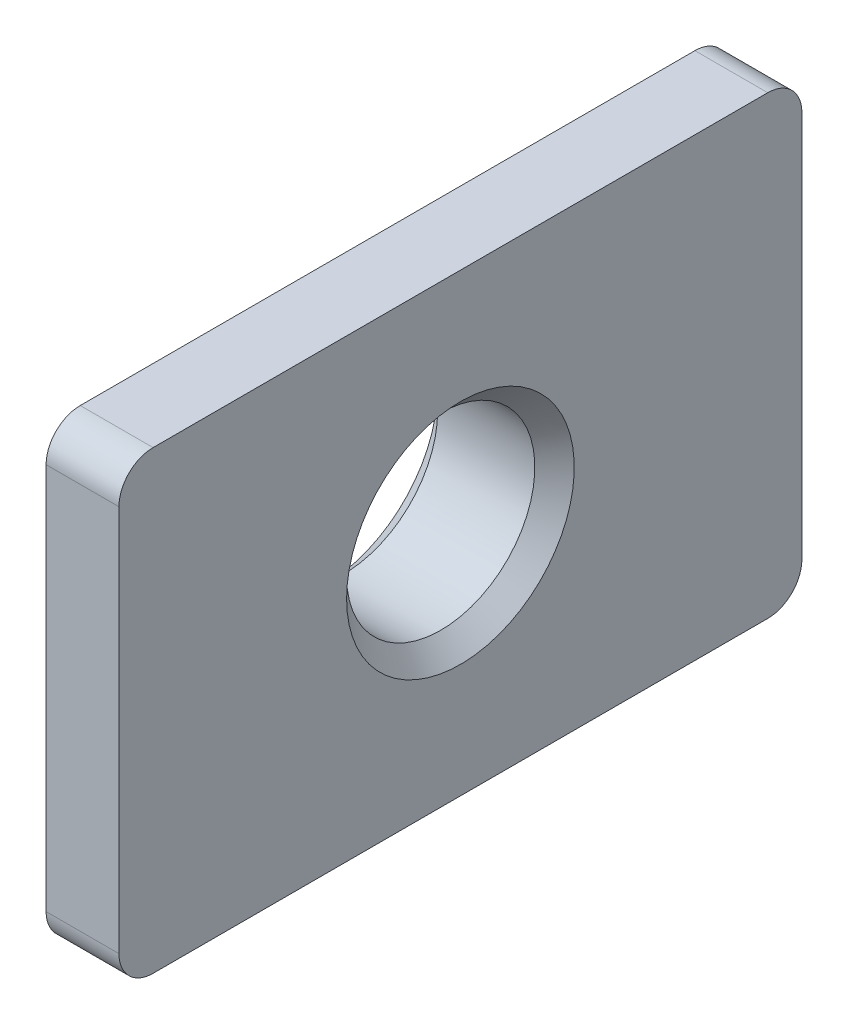
ISO-10303-21;
HEADER;
FILE_DESCRIPTION(('STEP AP214'),'2;1');
FILE_NAME('part.step','',(''),(''),'','','');
FILE_SCHEMA(('AUTOMOTIVE_DESIGN { 1 0 10303 214 1 1 1 1 }'));
ENDSEC;
DATA;
#1=APPLICATION_CONTEXT('core data for automotive mechanical design processes');
#2=APPLICATION_PROTOCOL_DEFINITION('international standard','automotive_design',2000,#1);
#3=PRODUCT_CONTEXT('',#1,'mechanical');
#4=PRODUCT('Part','Part','',(#3));
#5=PRODUCT_RELATED_PRODUCT_CATEGORY('part','',(#4));
#6=PRODUCT_DEFINITION_FORMATION('','',#4);
#7=PRODUCT_DEFINITION_CONTEXT('part definition',#1,'design');
#8=PRODUCT_DEFINITION('design','',#6,#7);
#9=PRODUCT_DEFINITION_SHAPE('','',#8);
#10=(LENGTH_UNIT() NAMED_UNIT(*) SI_UNIT(.MILLI.,.METRE.));
#11=(NAMED_UNIT(*) PLANE_ANGLE_UNIT() SI_UNIT($,.RADIAN.));
#12=(NAMED_UNIT(*) SI_UNIT($,.STERADIAN.) SOLID_ANGLE_UNIT());
#13=UNCERTAINTY_MEASURE_WITH_UNIT(LENGTH_MEASURE(1.E-05),#10,'distance_accuracy_value','');
#14=(GEOMETRIC_REPRESENTATION_CONTEXT(3) GLOBAL_UNCERTAINTY_ASSIGNED_CONTEXT((#13)) GLOBAL_UNIT_ASSIGNED_CONTEXT((#10,
#11,#12)) REPRESENTATION_CONTEXT('',''));
#15=CARTESIAN_POINT('',(0.,0.,0.));
#16=DIRECTION('',(0.,0.,1.));
#17=DIRECTION('',(1.,0.,0.));
#18=AXIS2_PLACEMENT_3D('',#15,#16,#17);
#19=CARTESIAN_POINT('',(0.,-4.25,6.75));
#20=DIRECTION('',(-1.,0.,0.));
#21=DIRECTION('',(0.,0.,1.));
#22=AXIS2_PLACEMENT_3D('',#19,#20,#21);
#23=CYLINDRICAL_SURFACE('',#22,0.75);
#24=CARTESIAN_POINT('',(-1.6,-4.25,6.75));
#25=DIRECTION('',(-1.,0.,0.));
#26=DIRECTION('',(0.,0.,1.));
#27=AXIS2_PLACEMENT_3D('',#24,#25,#26);
#28=CIRCLE('',#27,0.75);
#29=CARTESIAN_POINT('',(-1.6,-5.,6.75));
#30=VERTEX_POINT('',#29);
#31=CARTESIAN_POINT('',(-1.6,-4.25,7.5));
#32=VERTEX_POINT('',#31);
#33=EDGE_CURVE('E133',#30,#32,#28,.T.);
#34=ORIENTED_EDGE('',*,*,#33,.F.);
#35=DIRECTION('',(-1.,0.,0.));
#36=VECTOR('',#35,1.);
#37=CARTESIAN_POINT('',(0.,-5.,6.75));
#38=LINE('',#37,#36);
#39=CARTESIAN_POINT('',(0.,-5.,6.75));
#40=VERTEX_POINT('',#39);
#41=EDGE_CURVE('E50',#40,#30,#38,.T.);
#42=ORIENTED_EDGE('',*,*,#41,.F.);
#43=CARTESIAN_POINT('',(0.,-4.25,6.75));
#44=DIRECTION('',(-1.,0.,0.));
#45=DIRECTION('',(0.,0.,1.));
#46=AXIS2_PLACEMENT_3D('',#43,#44,#45);
#47=CIRCLE('',#46,0.75);
#48=CARTESIAN_POINT('',(0.,-4.25,7.5));
#49=VERTEX_POINT('',#48);
#50=EDGE_CURVE('E155',#40,#49,#47,.T.);
#51=ORIENTED_EDGE('',*,*,#50,.T.);
#52=DIRECTION('',(-1.,0.,0.));
#53=VECTOR('',#52,1.);
#54=CARTESIAN_POINT('',(0.,-4.25,7.5));
#55=LINE('',#54,#53);
#56=EDGE_CURVE('E91',#49,#32,#55,.T.);
#57=ORIENTED_EDGE('',*,*,#56,.T.);
#58=EDGE_LOOP('',(#34,#42,#51,#57));
#59=FACE_BOUND('',#58,.T.);
#60=ADVANCED_FACE('F33',(#59),#23,.T.);
#61=CARTESIAN_POINT('',(0.,-5.,-6.75));
#62=DIRECTION('',(0.,-1.,0.));
#63=DIRECTION('',(0.,0.,-1.));
#64=AXIS2_PLACEMENT_3D('',#61,#62,#63);
#65=PLANE('',#64);
#66=DIRECTION('',(0.,0.,1.));
#67=VECTOR('',#66,1.);
#68=CARTESIAN_POINT('',(-1.6,-5.,-6.75));
#69=LINE('',#68,#67);
#70=CARTESIAN_POINT('',(-1.6,-5.,-6.75));
#71=VERTEX_POINT('',#70);
#72=EDGE_CURVE('E152',#71,#30,#69,.T.);
#73=ORIENTED_EDGE('',*,*,#72,.F.);
#74=DIRECTION('',(-1.,0.,0.));
#75=VECTOR('',#74,1.);
#76=CARTESIAN_POINT('',(0.,-5.,-6.75));
#77=LINE('',#76,#75);
#78=CARTESIAN_POINT('',(0.,-5.,-6.75));
#79=VERTEX_POINT('',#78);
#80=EDGE_CURVE('E79',#79,#71,#77,.T.);
#81=ORIENTED_EDGE('',*,*,#80,.F.);
#82=DIRECTION('',(0.,0.,1.));
#83=VECTOR('',#82,1.);
#84=CARTESIAN_POINT('',(0.,-5.,-6.75));
#85=LINE('',#84,#83);
#86=EDGE_CURVE('E123',#79,#40,#85,.T.);
#87=ORIENTED_EDGE('',*,*,#86,.T.);
#88=ORIENTED_EDGE('',*,*,#41,.T.);
#89=EDGE_LOOP('',(#73,#81,#87,#88));
#90=FACE_BOUND('',#89,.T.);
#91=ADVANCED_FACE('F188',(#90),#65,.T.);
#92=CARTESIAN_POINT('',(0.,-4.25,-6.75));
#93=DIRECTION('',(-1.,0.,0.));
#94=DIRECTION('',(0.,0.,1.));
#95=AXIS2_PLACEMENT_3D('',#92,#93,#94);
#96=CYLINDRICAL_SURFACE('',#95,0.75);
#97=CARTESIAN_POINT('',(-1.6,-4.25,-6.75));
#98=DIRECTION('',(-1.,0.,0.));
#99=DIRECTION('',(0.,0.,1.));
#100=AXIS2_PLACEMENT_3D('',#97,#98,#99);
#101=CIRCLE('',#100,0.75);
#102=CARTESIAN_POINT('',(-1.6,-4.25,-7.5));
#103=VERTEX_POINT('',#102);
#104=EDGE_CURVE('E110',#103,#71,#101,.T.);
#105=ORIENTED_EDGE('',*,*,#104,.F.);
#106=DIRECTION('',(-1.,0.,0.));
#107=VECTOR('',#106,1.);
#108=CARTESIAN_POINT('',(0.,-4.25,-7.5));
#109=LINE('',#108,#107);
#110=CARTESIAN_POINT('',(0.,-4.25,-7.5));
#111=VERTEX_POINT('',#110);
#112=EDGE_CURVE('E105',#111,#103,#109,.T.);
#113=ORIENTED_EDGE('',*,*,#112,.F.);
#114=CARTESIAN_POINT('',(0.,-4.25,-6.75));
#115=DIRECTION('',(-1.,0.,0.));
#116=DIRECTION('',(0.,0.,1.));
#117=AXIS2_PLACEMENT_3D('',#114,#115,#116);
#118=CIRCLE('',#117,0.75);
#119=EDGE_CURVE('E108',#111,#79,#118,.T.);
#120=ORIENTED_EDGE('',*,*,#119,.T.);
#121=ORIENTED_EDGE('',*,*,#80,.T.);
#122=EDGE_LOOP('',(#105,#113,#120,#121));
#123=FACE_BOUND('',#122,.T.);
#124=ADVANCED_FACE('F107',(#123),#96,.T.);
#125=CARTESIAN_POINT('',(0.,4.25,-7.5));
#126=DIRECTION('',(0.,0.,-1.));
#127=DIRECTION('',(-1.,0.,0.));
#128=AXIS2_PLACEMENT_3D('',#125,#126,#127);
#129=PLANE('',#128);
#130=DIRECTION('',(0.,-1.,0.));
#131=VECTOR('',#130,1.);
#132=CARTESIAN_POINT('',(-1.6,4.25,-7.5));
#133=LINE('',#132,#131);
#134=CARTESIAN_POINT('',(-1.6,4.25,-7.5));
#135=VERTEX_POINT('',#134);
#136=EDGE_CURVE('E149',#135,#103,#133,.T.);
#137=ORIENTED_EDGE('',*,*,#136,.F.);
#138=DIRECTION('',(-1.,0.,0.));
#139=VECTOR('',#138,1.);
#140=CARTESIAN_POINT('',(0.,4.25,-7.5));
#141=LINE('',#140,#139);
#142=CARTESIAN_POINT('',(0.,4.25,-7.5));
#143=VERTEX_POINT('',#142);
#144=EDGE_CURVE('E115',#143,#135,#141,.T.);
#145=ORIENTED_EDGE('',*,*,#144,.F.);
#146=DIRECTION('',(0.,-1.,0.));
#147=VECTOR('',#146,1.);
#148=CARTESIAN_POINT('',(0.,4.25,-7.5));
#149=LINE('',#148,#147);
#150=EDGE_CURVE('E121',#143,#111,#149,.T.);
#151=ORIENTED_EDGE('',*,*,#150,.T.);
#152=ORIENTED_EDGE('',*,*,#112,.T.);
#153=EDGE_LOOP('',(#137,#145,#151,#152));
#154=FACE_BOUND('',#153,.T.);
#155=ADVANCED_FACE('F125',(#154),#129,.T.);
#156=CARTESIAN_POINT('',(0.,4.25,-6.75));
#157=DIRECTION('',(-1.,0.,0.));
#158=DIRECTION('',(0.,0.,1.));
#159=AXIS2_PLACEMENT_3D('',#156,#157,#158);
#160=CYLINDRICAL_SURFACE('',#159,0.75);
#161=CARTESIAN_POINT('',(-1.6,4.25,-6.75));
#162=DIRECTION('',(-1.,0.,0.));
#163=DIRECTION('',(0.,0.,1.));
#164=AXIS2_PLACEMENT_3D('',#161,#162,#163);
#165=CIRCLE('',#164,0.75);
#166=CARTESIAN_POINT('',(-1.6,5.,-6.75));
#167=VERTEX_POINT('',#166);
#168=EDGE_CURVE('E146',#167,#135,#165,.T.);
#169=ORIENTED_EDGE('',*,*,#168,.F.);
#170=DIRECTION('',(-1.,0.,0.));
#171=VECTOR('',#170,1.);
#172=CARTESIAN_POINT('',(0.,5.,-6.75));
#173=LINE('',#172,#171);
#174=CARTESIAN_POINT('',(0.,5.,-6.75));
#175=VERTEX_POINT('',#174);
#176=EDGE_CURVE('E160',#175,#167,#173,.T.);
#177=ORIENTED_EDGE('',*,*,#176,.F.);
#178=CARTESIAN_POINT('',(0.,4.25,-6.75));
#179=DIRECTION('',(-1.,0.,0.));
#180=DIRECTION('',(0.,0.,1.));
#181=AXIS2_PLACEMENT_3D('',#178,#179,#180);
#182=CIRCLE('',#181,0.75);
#183=EDGE_CURVE('E126',#175,#143,#182,.T.);
#184=ORIENTED_EDGE('',*,*,#183,.T.);
#185=ORIENTED_EDGE('',*,*,#144,.T.);
#186=EDGE_LOOP('',(#169,#177,#184,#185));
#187=FACE_BOUND('',#186,.T.);
#188=ADVANCED_FACE('F205',(#187),#160,.T.);
#189=CARTESIAN_POINT('',(0.,5.,6.75));
#190=DIRECTION('',(0.,1.,0.));
#191=DIRECTION('',(0.,0.,1.));
#192=AXIS2_PLACEMENT_3D('',#189,#190,#191);
#193=PLANE('',#192);
#194=DIRECTION('',(0.,0.,-1.));
#195=VECTOR('',#194,1.);
#196=CARTESIAN_POINT('',(-1.6,5.,6.75));
#197=LINE('',#196,#195);
#198=CARTESIAN_POINT('',(-1.6,5.,6.75));
#199=VERTEX_POINT('',#198);
#200=EDGE_CURVE('E143',#199,#167,#197,.T.);
#201=ORIENTED_EDGE('',*,*,#200,.F.);
#202=DIRECTION('',(-1.,0.,0.));
#203=VECTOR('',#202,1.);
#204=CARTESIAN_POINT('',(0.,5.,6.75));
#205=LINE('',#204,#203);
#206=CARTESIAN_POINT('',(0.,5.,6.75));
#207=VERTEX_POINT('',#206);
#208=EDGE_CURVE('E162',#207,#199,#205,.T.);
#209=ORIENTED_EDGE('',*,*,#208,.F.);
#210=DIRECTION('',(0.,0.,-1.));
#211=VECTOR('',#210,1.);
#212=CARTESIAN_POINT('',(0.,5.,6.75));
#213=LINE('',#212,#211);
#214=EDGE_CURVE('E128',#207,#175,#213,.T.);
#215=ORIENTED_EDGE('',*,*,#214,.T.);
#216=ORIENTED_EDGE('',*,*,#176,.T.);
#217=EDGE_LOOP('',(#201,#209,#215,#216));
#218=FACE_BOUND('',#217,.T.);
#219=ADVANCED_FACE('F201',(#218),#193,.T.);
#220=CARTESIAN_POINT('',(0.,4.25,6.75));
#221=DIRECTION('',(-1.,0.,0.));
#222=DIRECTION('',(0.,0.,1.));
#223=AXIS2_PLACEMENT_3D('',#220,#221,#222);
#224=CYLINDRICAL_SURFACE('',#223,0.75);
#225=CARTESIAN_POINT('',(-1.6,4.25,6.75));
#226=DIRECTION('',(-1.,0.,0.));
#227=DIRECTION('',(0.,0.,1.));
#228=AXIS2_PLACEMENT_3D('',#225,#226,#227);
#229=CIRCLE('',#228,0.75);
#230=CARTESIAN_POINT('',(-1.6,4.25,7.5));
#231=VERTEX_POINT('',#230);
#232=EDGE_CURVE('E140',#231,#199,#229,.T.);
#233=ORIENTED_EDGE('',*,*,#232,.F.);
#234=DIRECTION('',(-1.,0.,0.));
#235=VECTOR('',#234,1.);
#236=CARTESIAN_POINT('',(0.,4.25,7.5));
#237=LINE('',#236,#235);
#238=CARTESIAN_POINT('',(0.,4.25,7.5));
#239=VERTEX_POINT('',#238);
#240=EDGE_CURVE('E164',#239,#231,#237,.T.);
#241=ORIENTED_EDGE('',*,*,#240,.F.);
#242=CARTESIAN_POINT('',(0.,4.25,6.75));
#243=DIRECTION('',(-1.,0.,0.));
#244=DIRECTION('',(0.,0.,1.));
#245=AXIS2_PLACEMENT_3D('',#242,#243,#244);
#246=CIRCLE('',#245,0.75);
#247=EDGE_CURVE('E329',#239,#207,#246,.T.);
#248=ORIENTED_EDGE('',*,*,#247,.T.);
#249=ORIENTED_EDGE('',*,*,#208,.T.);
#250=EDGE_LOOP('',(#233,#241,#248,#249));
#251=FACE_BOUND('',#250,.T.);
#252=ADVANCED_FACE('F198',(#251),#224,.T.);
#253=CARTESIAN_POINT('',(0.,-4.25,7.5));
#254=DIRECTION('',(0.,0.,1.));
#255=DIRECTION('',(1.,0.,0.));
#256=AXIS2_PLACEMENT_3D('',#253,#254,#255);
#257=PLANE('',#256);
#258=DIRECTION('',(0.,1.,0.));
#259=VECTOR('',#258,1.);
#260=CARTESIAN_POINT('',(-1.6,-4.25,7.5));
#261=LINE('',#260,#259);
#262=EDGE_CURVE('E136',#32,#231,#261,.T.);
#263=ORIENTED_EDGE('',*,*,#262,.F.);
#264=ORIENTED_EDGE('',*,*,#56,.F.);
#265=DIRECTION('',(0.,1.,0.));
#266=VECTOR('',#265,1.);
#267=CARTESIAN_POINT('',(0.,-4.25,7.5));
#268=LINE('',#267,#266);
#269=EDGE_CURVE('E327',#49,#239,#268,.T.);
#270=ORIENTED_EDGE('',*,*,#269,.T.);
#271=ORIENTED_EDGE('',*,*,#240,.T.);
#272=EDGE_LOOP('',(#263,#264,#270,#271));
#273=FACE_BOUND('',#272,.T.);
#274=ADVANCED_FACE('F195',(#273),#257,.T.);
#275=CARTESIAN_POINT('',(0.,-4.25,6.75));
#276=DIRECTION('',(-1.,0.,0.));
#277=DIRECTION('',(0.,0.,1.));
#278=AXIS2_PLACEMENT_3D('',#275,#276,#277);
#279=PLANE('',#278);
#280=CARTESIAN_POINT('',(0.,0.,0.));
#281=DIRECTION('',(-1.,0.,0.));
#282=DIRECTION('',(0.,0.,1.));
#283=AXIS2_PLACEMENT_3D('',#280,#281,#282);
#284=CIRCLE('',#283,2.49999999998679);
#285=CARTESIAN_POINT('',(0.,0.,2.49999999998679));
#286=VERTEX_POINT('',#285);
#287=EDGE_CURVE('E42',#286,#286,#284,.T.);
#288=ORIENTED_EDGE('',*,*,#287,.T.);
#289=EDGE_LOOP('',(#288));
#290=FACE_BOUND('',#289,.T.);
#291=ORIENTED_EDGE('',*,*,#50,.F.);
#292=ORIENTED_EDGE('',*,*,#86,.F.);
#293=ORIENTED_EDGE('',*,*,#119,.F.);
#294=ORIENTED_EDGE('',*,*,#150,.F.);
#295=ORIENTED_EDGE('',*,*,#183,.F.);
#296=ORIENTED_EDGE('',*,*,#214,.F.);
#297=ORIENTED_EDGE('',*,*,#247,.F.);
#298=ORIENTED_EDGE('',*,*,#269,.F.);
#299=EDGE_LOOP('',(#291,#292,#293,#294,#295,#296,#297,#298));
#300=FACE_BOUND('',#299,.T.);
#301=ADVANCED_FACE('F119',(#290,#300),#279,.F.);
#302=CARTESIAN_POINT('',(-1.6,-4.25,6.75));
#303=DIRECTION('',(-1.,0.,0.));
#304=DIRECTION('',(0.,0.,1.));
#305=AXIS2_PLACEMENT_3D('',#302,#303,#304);
#306=PLANE('',#305);
#307=CARTESIAN_POINT('',(-1.6,0.,0.));
#308=DIRECTION('',(-1.,0.,0.));
#309=DIRECTION('',(0.,0.,1.));
#310=AXIS2_PLACEMENT_3D('',#307,#308,#309);
#311=CIRCLE('',#310,3.45);
#312=CARTESIAN_POINT('',(-1.6,0.,3.45));
#313=VERTEX_POINT('',#312);
#314=EDGE_CURVE('E157',#313,#313,#311,.T.);
#315=ORIENTED_EDGE('',*,*,#314,.F.);
#316=EDGE_LOOP('',(#315));
#317=FACE_BOUND('',#316,.T.);
#318=ORIENTED_EDGE('',*,*,#33,.T.);
#319=ORIENTED_EDGE('',*,*,#262,.T.);
#320=ORIENTED_EDGE('',*,*,#232,.T.);
#321=ORIENTED_EDGE('',*,*,#200,.T.);
#322=ORIENTED_EDGE('',*,*,#168,.T.);
#323=ORIENTED_EDGE('',*,*,#136,.T.);
#324=ORIENTED_EDGE('',*,*,#104,.T.);
#325=ORIENTED_EDGE('',*,*,#72,.T.);
#326=EDGE_LOOP('',(#318,#319,#320,#321,#322,#323,#324,#325));
#327=FACE_BOUND('',#326,.T.);
#328=ADVANCED_FACE('F214',(#317,#327),#306,.T.);
#329=CARTESIAN_POINT('',(8.15807358037436,0.,0.));
#330=DIRECTION('',(-1.,0.,0.));
#331=DIRECTION('',(0.,0.,1.));
#332=AXIS2_PLACEMENT_3D('',#329,#330,#331);
#333=CYLINDRICAL_SURFACE('',#332,3.45);
#334=ORIENTED_EDGE('',*,*,#314,.T.);
#335=EDGE_LOOP('',(#334));
#336=FACE_BOUND('',#335,.T.);
#337=CARTESIAN_POINT('',(-3.,0.,0.));
#338=DIRECTION('',(-1.,0.,0.));
#339=DIRECTION('',(0.,0.,-1.));
#340=AXIS2_PLACEMENT_3D('',#337,#338,#339);
#341=CIRCLE('',#340,3.45);
#342=CARTESIAN_POINT('',(-3.,0.,-3.45));
#343=VERTEX_POINT('',#342);
#344=EDGE_CURVE('E137',#343,#343,#341,.T.);
#345=ORIENTED_EDGE('',*,*,#344,.F.);
#346=EDGE_LOOP('',(#345));
#347=FACE_BOUND('',#346,.T.);
#348=ADVANCED_FACE('F217',(#336,#347),#333,.T.);
#349=CARTESIAN_POINT('',(-3.,0.,0.));
#350=DIRECTION('',(1.,0.,0.));
#351=DIRECTION('',(0.,0.,-1.));
#352=AXIS2_PLACEMENT_3D('',#349,#350,#351);
#353=PLANE('',#352);
#354=CARTESIAN_POINT('',(-3.,0.,0.));
#355=DIRECTION('',(1.,0.,0.));
#356=DIRECTION('',(0.,0.,-1.));
#357=AXIS2_PLACEMENT_3D('',#354,#355,#356);
#358=CIRCLE('',#357,2.49999999996338);
#359=CARTESIAN_POINT('',(-3.,0.,-2.49999999996338));
#360=VERTEX_POINT('',#359);
#361=EDGE_CURVE('E172',#360,#360,#358,.T.);
#362=ORIENTED_EDGE('',*,*,#361,.T.);
#363=EDGE_LOOP('',(#362));
#364=FACE_BOUND('',#363,.T.);
#365=ORIENTED_EDGE('',*,*,#344,.T.);
#366=EDGE_LOOP('',(#365));
#367=FACE_BOUND('',#366,.T.);
#368=ADVANCED_FACE('F223',(#364,#367),#353,.F.);
#369=CARTESIAN_POINT('',(-3.,0.,0.));
#370=DIRECTION('',(-1.,0.,0.));
#371=DIRECTION('',(0.,0.,1.));
#372=AXIS2_PLACEMENT_3D('',#369,#370,#371);
#373=CYLINDRICAL_SURFACE('',#372,2.06699999999999);
#374=CARTESIAN_POINT('',(-0.432999999986806,0.,0.));
#375=DIRECTION('',(-1.,0.,0.));
#376=DIRECTION('',(0.,0.,1.));
#377=AXIS2_PLACEMENT_3D('',#374,#375,#376);
#378=CIRCLE('',#377,2.06699999999999);
#379=CARTESIAN_POINT('',(-0.432999999986806,0.,2.06699999999999));
#380=VERTEX_POINT('',#379);
#381=EDGE_CURVE('E11',#380,#380,#378,.F.);
#382=ORIENTED_EDGE('',*,*,#381,.T.);
#383=EDGE_LOOP('',(#382));
#384=FACE_BOUND('',#383,.T.);
#385=CARTESIAN_POINT('',(-2.56700000003661,0.,0.));
#386=DIRECTION('',(1.,0.,0.));
#387=DIRECTION('',(0.,0.,-1.));
#388=AXIS2_PLACEMENT_3D('',#385,#386,#387);
#389=CIRCLE('',#388,2.06699999999999);
#390=CARTESIAN_POINT('',(-2.56700000003661,0.,-2.06699999999999));
#391=VERTEX_POINT('',#390);
#392=EDGE_CURVE('E169',#391,#391,#389,.F.);
#393=ORIENTED_EDGE('',*,*,#392,.T.);
#394=EDGE_LOOP('',(#393));
#395=FACE_BOUND('',#394,.T.);
#396=ADVANCED_FACE('F184',(#384,#395),#373,.F.);
#397=CARTESIAN_POINT('',(-2.56700000003661,0.,0.));
#398=DIRECTION('',(-1.,0.,0.));
#399=DIRECTION('',(0.,0.,1.));
#400=AXIS2_PLACEMENT_3D('',#397,#398,#399);
#401=CONICAL_SURFACE('',#400,2.06699999999999,0.785398163397448);
#402=ORIENTED_EDGE('',*,*,#361,.F.);
#403=EDGE_LOOP('',(#402));
#404=FACE_BOUND('',#403,.T.);
#405=ORIENTED_EDGE('',*,*,#392,.F.);
#406=EDGE_LOOP('',(#405));
#407=FACE_BOUND('',#406,.T.);
#408=ADVANCED_FACE('F179',(#404,#407),#401,.F.);
#409=CARTESIAN_POINT('',(0.,0.,0.));
#410=DIRECTION('',(1.,0.,0.));
#411=DIRECTION('',(0.,0.,-1.));
#412=AXIS2_PLACEMENT_3D('',#409,#410,#411);
#413=CONICAL_SURFACE('',#412,2.49999999998679,0.785398163397446);
#414=ORIENTED_EDGE('',*,*,#381,.F.);
#415=EDGE_LOOP('',(#414));
#416=FACE_BOUND('',#415,.T.);
#417=ORIENTED_EDGE('',*,*,#287,.F.);
#418=EDGE_LOOP('',(#417));
#419=FACE_BOUND('',#418,.T.);
#420=ADVANCED_FACE('F35',(#416,#419),#413,.F.);
#421=CLOSED_SHELL('',(#60,#91,#124,#155,#188,#219,#252,#274,#301,#328,#348,#368,#396,#408,#420));
#422=MANIFOLD_SOLID_BREP('B2',#421);
#423=ADVANCED_BREP_SHAPE_REPRESENTATION('',(#18,#422),#14);
#424=SHAPE_DEFINITION_REPRESENTATION(#9,#423);
ENDSEC;
END-ISO-10303-21;
